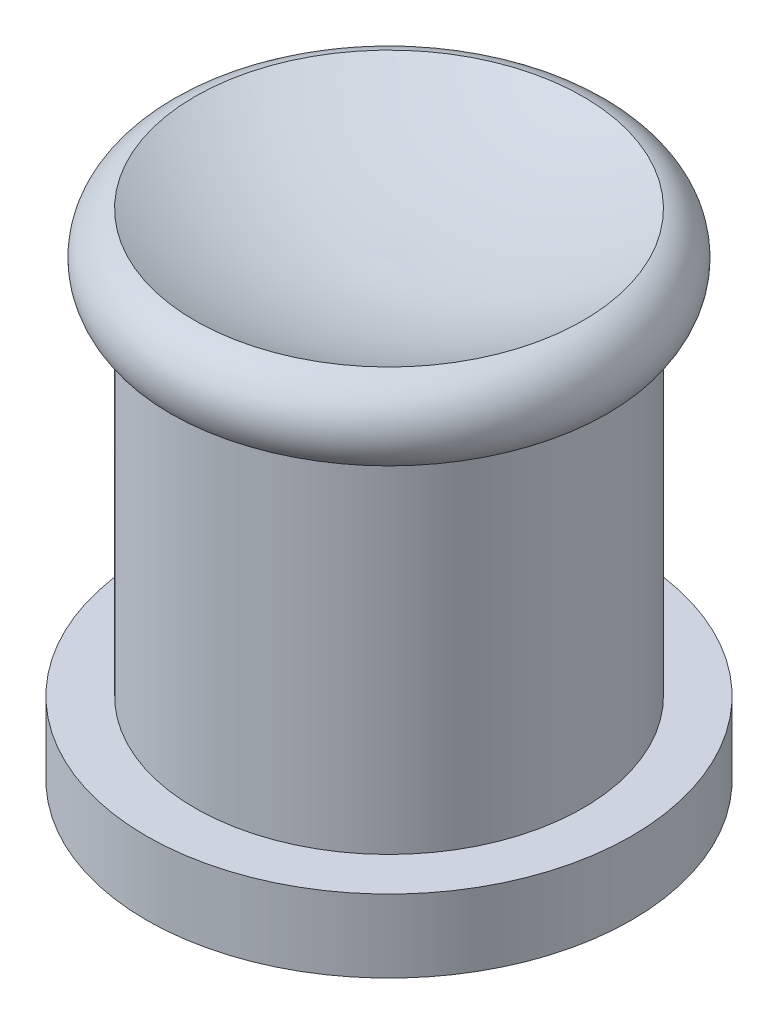
ISO-10303-21;
HEADER;
FILE_DESCRIPTION(('STEP AP214'),'2;1');
FILE_NAME('part.step','',(''),(''),'','','');
FILE_SCHEMA(('AUTOMOTIVE_DESIGN { 1 0 10303 214 1 1 1 1 }'));
ENDSEC;
DATA;
#1=APPLICATION_CONTEXT('core data for automotive mechanical design processes');
#2=APPLICATION_PROTOCOL_DEFINITION('international standard','automotive_design',2000,#1);
#3=PRODUCT_CONTEXT('',#1,'mechanical');
#4=PRODUCT('Part','Part','',(#3));
#5=PRODUCT_RELATED_PRODUCT_CATEGORY('part','',(#4));
#6=PRODUCT_DEFINITION_FORMATION('','',#4);
#7=PRODUCT_DEFINITION_CONTEXT('part definition',#1,'design');
#8=PRODUCT_DEFINITION('design','',#6,#7);
#9=PRODUCT_DEFINITION_SHAPE('','',#8);
#10=(LENGTH_UNIT() NAMED_UNIT(*) SI_UNIT(.MILLI.,.METRE.));
#11=(NAMED_UNIT(*) PLANE_ANGLE_UNIT() SI_UNIT($,.RADIAN.));
#12=(NAMED_UNIT(*) SI_UNIT($,.STERADIAN.) SOLID_ANGLE_UNIT());
#13=UNCERTAINTY_MEASURE_WITH_UNIT(LENGTH_MEASURE(1.E-05),#10,'distance_accuracy_value','');
#14=(GEOMETRIC_REPRESENTATION_CONTEXT(3) GLOBAL_UNCERTAINTY_ASSIGNED_CONTEXT((#13)) GLOBAL_UNIT_ASSIGNED_CONTEXT((#10,
#11,#12)) REPRESENTATION_CONTEXT('',''));
#15=CARTESIAN_POINT('',(0.,0.,0.));
#16=DIRECTION('',(0.,0.,1.));
#17=DIRECTION('',(1.,0.,0.));
#18=AXIS2_PLACEMENT_3D('',#15,#16,#17);
#19=CARTESIAN_POINT('',(0.,0.,0.));
#20=DIRECTION('',(0.,1.,0.));
#21=DIRECTION('',(-1.,0.,0.));
#22=AXIS2_PLACEMENT_3D('',#19,#20,#21);
#23=PLANE('',#22);
#24=CARTESIAN_POINT('',(0.,0.,0.));
#25=DIRECTION('',(0.,1.,0.));
#26=DIRECTION('',(-1.,0.,0.));
#27=AXIS2_PLACEMENT_3D('',#24,#25,#26);
#28=CIRCLE('',#27,0.5);
#29=CARTESIAN_POINT('',(-0.5,0.,0.));
#30=VERTEX_POINT('',#29);
#31=EDGE_CURVE('E11',#30,#30,#28,.T.);
#32=ORIENTED_EDGE('',*,*,#31,.F.);
#33=EDGE_LOOP('',(#32));
#34=FACE_BOUND('',#33,.T.);
#35=ADVANCED_FACE('F32',(#34),#23,.F.);
#36=CARTESIAN_POINT('',(0.,0.93,0.));
#37=DIRECTION('',(0.,1.,0.));
#38=DIRECTION('',(-1.,0.,0.));
#39=AXIS2_PLACEMENT_3D('',#36,#37,#38);
#40=CYLINDRICAL_SURFACE('',#39,0.5);
#41=CARTESIAN_POINT('',(0.,0.15,0.));
#42=DIRECTION('',(0.,1.,0.));
#43=DIRECTION('',(-1.,0.,0.));
#44=AXIS2_PLACEMENT_3D('',#41,#42,#43);
#45=CIRCLE('',#44,0.5);
#46=CARTESIAN_POINT('',(-0.5,0.15,0.));
#47=VERTEX_POINT('',#46);
#48=EDGE_CURVE('E38',#47,#47,#45,.T.);
#49=ORIENTED_EDGE('',*,*,#48,.F.);
#50=EDGE_LOOP('',(#49));
#51=FACE_BOUND('',#50,.T.);
#52=ORIENTED_EDGE('',*,*,#31,.T.);
#53=EDGE_LOOP('',(#52));
#54=FACE_BOUND('',#53,.T.);
#55=ADVANCED_FACE('F65',(#51,#54),#40,.T.);
#56=CARTESIAN_POINT('',(0.5,0.15,0.));
#57=DIRECTION('',(0.,-1.,0.));
#58=DIRECTION('',(1.,0.,0.));
#59=AXIS2_PLACEMENT_3D('',#56,#57,#58);
#60=PLANE('',#59);
#61=CARTESIAN_POINT('',(0.,0.15,0.));
#62=DIRECTION('',(0.,1.,0.));
#63=DIRECTION('',(-1.,0.,0.));
#64=AXIS2_PLACEMENT_3D('',#61,#62,#63);
#65=CIRCLE('',#64,0.4);
#66=CARTESIAN_POINT('',(-0.4,0.15,0.));
#67=VERTEX_POINT('',#66);
#68=EDGE_CURVE('E58',#67,#67,#65,.T.);
#69=ORIENTED_EDGE('',*,*,#68,.F.);
#70=EDGE_LOOP('',(#69));
#71=FACE_BOUND('',#70,.T.);
#72=ORIENTED_EDGE('',*,*,#48,.T.);
#73=EDGE_LOOP('',(#72));
#74=FACE_BOUND('',#73,.T.);
#75=ADVANCED_FACE('F63',(#71,#74),#60,.F.);
#76=CARTESIAN_POINT('',(0.,0.93,0.));
#77=DIRECTION('',(0.,1.,0.));
#78=DIRECTION('',(-1.,0.,0.));
#79=AXIS2_PLACEMENT_3D('',#76,#77,#78);
#80=CYLINDRICAL_SURFACE('',#79,0.4);
#81=CARTESIAN_POINT('',(0.,0.85,0.));
#82=DIRECTION('',(0.,1.,0.));
#83=DIRECTION('',(-1.,0.,0.));
#84=AXIS2_PLACEMENT_3D('',#81,#82,#83);
#85=CIRCLE('',#84,0.4);
#86=CARTESIAN_POINT('',(-0.400000000000001,0.85,0.));
#87=VERTEX_POINT('',#86);
#88=EDGE_CURVE('E53',#87,#87,#85,.T.);
#89=ORIENTED_EDGE('',*,*,#88,.F.);
#90=EDGE_LOOP('',(#89));
#91=FACE_BOUND('',#90,.T.);
#92=ORIENTED_EDGE('',*,*,#68,.T.);
#93=EDGE_LOOP('',(#92));
#94=FACE_BOUND('',#93,.T.);
#95=ADVANCED_FACE('F83',(#91,#94),#80,.T.);
#96=CARTESIAN_POINT('',(0.,0.85,0.));
#97=DIRECTION('',(0.,1.,0.));
#98=DIRECTION('',(-1.,0.,0.));
#99=AXIS2_PLACEMENT_3D('',#96,#97,#98);
#100=CONICAL_SURFACE('',#99,0.4,1.0471975511966);
#101=CARTESIAN_POINT('',(0.,0.878867513459481,0.));
#102=DIRECTION('',(0.,1.,0.));
#103=DIRECTION('',(-1.,0.,0.));
#104=AXIS2_PLACEMENT_3D('',#101,#102,#103);
#105=CIRCLE('',#104,0.45);
#106=CARTESIAN_POINT('',(-0.450000000000001,0.878867513459481,0.));
#107=VERTEX_POINT('',#106);
#108=EDGE_CURVE('E50',#107,#107,#105,.T.);
#109=ORIENTED_EDGE('',*,*,#108,.F.);
#110=EDGE_LOOP('',(#109));
#111=FACE_BOUND('',#110,.T.);
#112=ORIENTED_EDGE('',*,*,#88,.T.);
#113=EDGE_LOOP('',(#112));
#114=FACE_BOUND('',#113,.T.);
#115=ADVANCED_FACE('F91',(#111,#114),#100,.T.);
#116=CARTESIAN_POINT('',(0.,0.932752128019087,0.));
#117=DIRECTION('',(0.,1.,0.));
#118=DIRECTION('',(-1.,0.,0.));
#119=AXIS2_PLACEMENT_3D('',#116,#117,#118);
#120=TOROIDAL_SURFACE('',#119,0.377913605210396,0.09);
#121=CARTESIAN_POINT('',(0.,1.02,0.));
#122=DIRECTION('',(0.,1.,0.));
#123=DIRECTION('',(-1.,0.,0.));
#124=AXIS2_PLACEMENT_3D('',#121,#122,#123);
#125=CIRCLE('',#124,0.4);
#126=CARTESIAN_POINT('',(-0.400000000000001,1.02,0.));
#127=VERTEX_POINT('',#126);
#128=EDGE_CURVE('E48',#127,#127,#125,.T.);
#129=ORIENTED_EDGE('',*,*,#128,.F.);
#130=EDGE_LOOP('',(#129));
#131=FACE_BOUND('',#130,.T.);
#132=ORIENTED_EDGE('',*,*,#108,.T.);
#133=EDGE_LOOP('',(#132));
#134=FACE_BOUND('',#133,.T.);
#135=ADVANCED_FACE('F44',(#131,#134),#120,.T.);
#136=CARTESIAN_POINT('',(-0.0302537586965634,1.72942773912639,0.));
#137=DIRECTION('',(0.,0.,-1.));
#138=DIRECTION('',(-1.,0.,0.));
#139=AXIS2_PLACEMENT_3D('',#136,#137,#138);
#140=CIRCLE('',#139,0.8);
#141=TRIMMED_CURVE('',#140,(PARAMETER_VALUE(-1.60862254495606)),
(PARAMETER_VALUE(1.60862254495606)),.T.,.PARAMETER.);
#142=CARTESIAN_POINT('',(0.,1.72942773912639,0.));
#143=DIRECTION('',(0.,1.,0.));
#144=AXIS1_PLACEMENT('',#142,#143);
#145=SURFACE_OF_REVOLUTION('',#141,#144);
#146=CARTESIAN_POINT('',(0.,0.93,0.));
#147=VERTEX_POINT('',#146);
#148=VERTEX_LOOP('',#147);
#149=FACE_BOUND('',#148,.T.);
#150=ORIENTED_EDGE('',*,*,#128,.T.);
#151=EDGE_LOOP('',(#150));
#152=FACE_BOUND('',#151,.T.);
#153=ADVANCED_FACE('F41',(#149,#152),#145,.F.);
#154=CLOSED_SHELL('',(#35,#55,#75,#95,#115,#135,#153));
#155=MANIFOLD_SOLID_BREP('B2',#154);
#156=ADVANCED_BREP_SHAPE_REPRESENTATION('',(#18,#155),#14);
#157=SHAPE_DEFINITION_REPRESENTATION(#9,#156);
ENDSEC;
END-ISO-10303-21;
